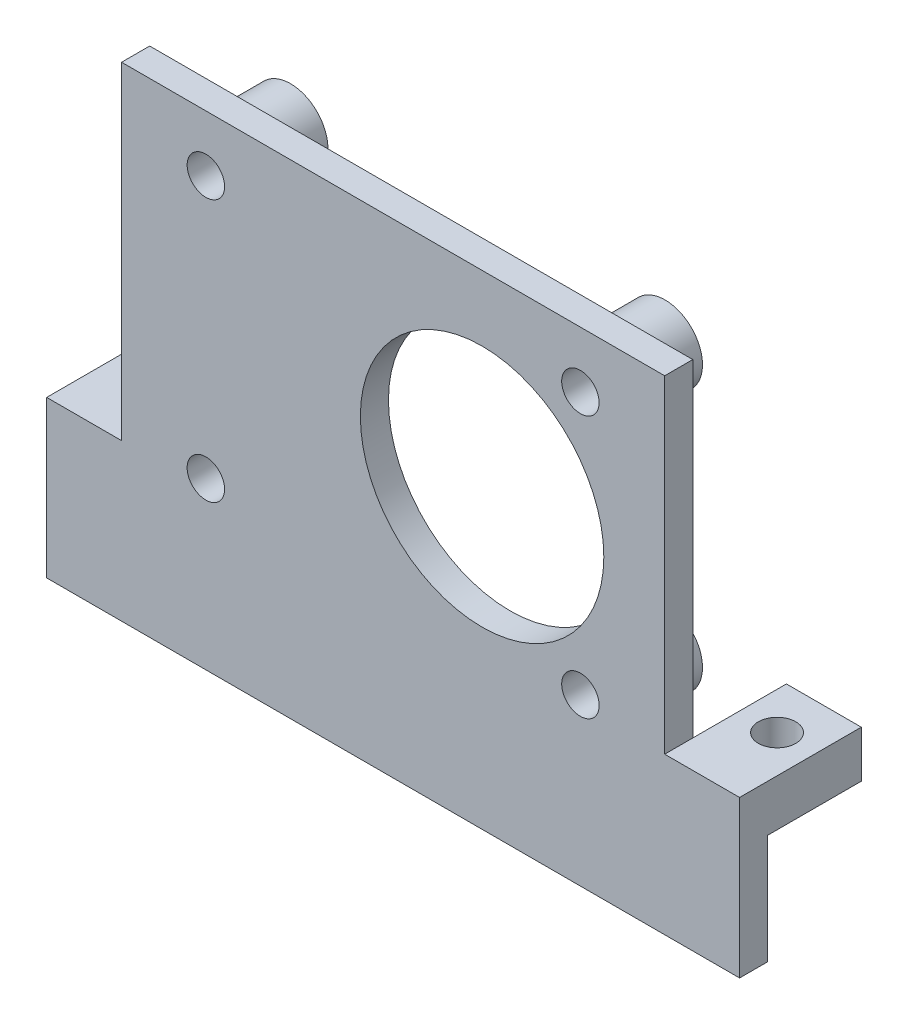
ISO-10303-21;
HEADER;
FILE_DESCRIPTION(('STEP AP214'),'2;1');
FILE_NAME('part.step','',(''),(''),'','','');
FILE_SCHEMA(('AUTOMOTIVE_DESIGN { 1 0 10303 214 1 1 1 1 }'));
ENDSEC;
DATA;
#1=APPLICATION_CONTEXT('core data for automotive mechanical design processes');
#2=APPLICATION_PROTOCOL_DEFINITION('international standard','automotive_design',2000,#1);
#3=PRODUCT_CONTEXT('',#1,'mechanical');
#4=PRODUCT('Part','Part','',(#3));
#5=PRODUCT_RELATED_PRODUCT_CATEGORY('part','',(#4));
#6=PRODUCT_DEFINITION_FORMATION('','',#4);
#7=PRODUCT_DEFINITION_CONTEXT('part definition',#1,'design');
#8=PRODUCT_DEFINITION('design','',#6,#7);
#9=PRODUCT_DEFINITION_SHAPE('','',#8);
#10=(LENGTH_UNIT() NAMED_UNIT(*) SI_UNIT(.MILLI.,.METRE.));
#11=(NAMED_UNIT(*) PLANE_ANGLE_UNIT() SI_UNIT($,.RADIAN.));
#12=(NAMED_UNIT(*) SI_UNIT($,.STERADIAN.) SOLID_ANGLE_UNIT());
#13=UNCERTAINTY_MEASURE_WITH_UNIT(LENGTH_MEASURE(1.E-05),#10,'distance_accuracy_value','');
#14=(GEOMETRIC_REPRESENTATION_CONTEXT(3) GLOBAL_UNCERTAINTY_ASSIGNED_CONTEXT((#13)) GLOBAL_UNIT_ASSIGNED_CONTEXT((#10,
#11,#12)) REPRESENTATION_CONTEXT('',''));
#15=CARTESIAN_POINT('',(0.,0.,0.));
#16=DIRECTION('',(0.,0.,1.));
#17=DIRECTION('',(1.,0.,0.));
#18=AXIS2_PLACEMENT_3D('',#15,#16,#17);
#19=CARTESIAN_POINT('',(49.,35.8359502095322,17.3521564849681));
#20=DIRECTION('',(0.,0.,-1.));
#21=DIRECTION('',(-1.,0.,0.));
#22=AXIS2_PLACEMENT_3D('',#19,#20,#21);
#23=CYLINDRICAL_SURFACE('',#22,2.);
#24=CARTESIAN_POINT('',(49.,35.8359502095322,0.));
#25=DIRECTION('',(0.,0.,1.));
#26=DIRECTION('',(1.,0.,0.));
#27=AXIS2_PLACEMENT_3D('',#24,#25,#26);
#28=CIRCLE('',#27,2.);
#29=CARTESIAN_POINT('',(51.,35.8359502095322,0.));
#30=VERTEX_POINT('',#29);
#31=EDGE_CURVE('E211',#30,#30,#28,.T.);
#32=ORIENTED_EDGE('',*,*,#31,.F.);
#33=EDGE_LOOP('',(#32));
#34=FACE_BOUND('',#33,.T.);
#35=CARTESIAN_POINT('',(49.,35.8359502095322,9.03844798598337));
#36=DIRECTION('',(0.,0.,1.));
#37=DIRECTION('',(1.,0.,0.));
#38=AXIS2_PLACEMENT_3D('',#35,#36,#37);
#39=CIRCLE('',#38,2.);
#40=CARTESIAN_POINT('',(51.,35.8359502095322,9.03844798598337));
#41=VERTEX_POINT('',#40);
#42=EDGE_CURVE('E360',#41,#41,#39,.F.);
#43=ORIENTED_EDGE('',*,*,#42,.F.);
#44=EDGE_LOOP('',(#43));
#45=FACE_BOUND('',#44,.T.);
#46=ADVANCED_FACE('F47',(#34,#45),#23,.F.);
#47=CARTESIAN_POINT('',(49.,35.8359502095322,17.3521564849681));
#48=DIRECTION('',(0.,0.,-1.));
#49=DIRECTION('',(-1.,0.,0.));
#50=AXIS2_PLACEMENT_3D('',#47,#48,#49);
#51=CYLINDRICAL_SURFACE('',#50,4.00000000000001);
#52=CARTESIAN_POINT('',(49.,35.8359502095322,0.));
#53=DIRECTION('',(0.,0.,1.));
#54=DIRECTION('',(1.,0.,0.));
#55=AXIS2_PLACEMENT_3D('',#52,#53,#54);
#56=CIRCLE('',#55,4.00000000000001);
#57=CARTESIAN_POINT('',(53.,35.8359502095322,0.));
#58=VERTEX_POINT('',#57);
#59=EDGE_CURVE('E208',#58,#58,#56,.T.);
#60=ORIENTED_EDGE('',*,*,#59,.T.);
#61=EDGE_LOOP('',(#60));
#62=FACE_BOUND('',#61,.T.);
#63=CARTESIAN_POINT('',(49.,35.8359502095322,6.03844798598337));
#64=DIRECTION('',(0.,0.,1.));
#65=DIRECTION('',(1.,0.,0.));
#66=AXIS2_PLACEMENT_3D('',#63,#64,#65);
#67=CIRCLE('',#66,4.00000000000001);
#68=CARTESIAN_POINT('',(53.,35.8359502095322,6.03844798598337));
#69=VERTEX_POINT('',#68);
#70=EDGE_CURVE('E214',#69,#69,#67,.T.);
#71=ORIENTED_EDGE('',*,*,#70,.F.);
#72=EDGE_LOOP('',(#71));
#73=FACE_BOUND('',#72,.T.);
#74=ADVANCED_FACE('F49',(#62,#73),#51,.T.);
#75=CARTESIAN_POINT('',(0.,0.,0.));
#76=DIRECTION('',(0.,0.,1.));
#77=DIRECTION('',(1.,0.,0.));
#78=AXIS2_PLACEMENT_3D('',#75,#76,#77);
#79=PLANE('',#78);
#80=ORIENTED_EDGE('',*,*,#31,.T.);
#81=EDGE_LOOP('',(#80));
#82=FACE_BOUND('',#81,.T.);
#83=ORIENTED_EDGE('',*,*,#59,.F.);
#84=EDGE_LOOP('',(#83));
#85=FACE_BOUND('',#84,.T.);
#86=ADVANCED_FACE('F228',(#82,#85),#79,.F.);
#87=CARTESIAN_POINT('',(0.,0.,6.03844798598337));
#88=DIRECTION('',(0.,0.,1.));
#89=DIRECTION('',(1.,0.,0.));
#90=AXIS2_PLACEMENT_3D('',#87,#88,#89);
#91=PLANE('',#90);
#92=CARTESIAN_POINT('',(38.5,21.8359502095322,6.03844798598337));
#93=DIRECTION('',(0.,0.,1.));
#94=DIRECTION('',(1.,0.,0.));
#95=AXIS2_PLACEMENT_3D('',#92,#93,#94);
#96=CIRCLE('',#95,13.);
#97=CARTESIAN_POINT('',(51.5,21.8359502095322,6.03844798598337));
#98=VERTEX_POINT('',#97);
#99=EDGE_CURVE('E354',#98,#98,#96,.F.);
#100=ORIENTED_EDGE('',*,*,#99,.F.);
#101=EDGE_LOOP('',(#100));
#102=FACE_BOUND('',#101,.T.);
#103=CARTESIAN_POINT('',(9.,35.8359502095322,6.03844798598337));
#104=DIRECTION('',(0.,0.,1.));
#105=DIRECTION('',(1.,0.,0.));
#106=AXIS2_PLACEMENT_3D('',#103,#104,#105);
#107=CIRCLE('',#106,4.);
#108=CARTESIAN_POINT('',(13.,35.8359502095322,6.03844798598337));
#109=VERTEX_POINT('',#108);
#110=EDGE_CURVE('E12',#109,#109,#107,.F.);
#111=ORIENTED_EDGE('',*,*,#110,.F.);
#112=EDGE_LOOP('',(#111));
#113=FACE_BOUND('',#112,.T.);
#114=CARTESIAN_POINT('',(9.,7.8359502095322,6.03844798598337));
#115=DIRECTION('',(0.,0.,1.));
#116=DIRECTION('',(1.,0.,0.));
#117=AXIS2_PLACEMENT_3D('',#114,#115,#116);
#118=CIRCLE('',#117,4.);
#119=CARTESIAN_POINT('',(13.,7.8359502095322,6.03844798598337));
#120=VERTEX_POINT('',#119);
#121=EDGE_CURVE('E56',#120,#120,#118,.F.);
#122=ORIENTED_EDGE('',*,*,#121,.F.);
#123=EDGE_LOOP('',(#122));
#124=FACE_BOUND('',#123,.T.);
#125=CARTESIAN_POINT('',(49.,7.8359502095322,6.03844798598337));
#126=DIRECTION('',(0.,0.,1.));
#127=DIRECTION('',(1.,0.,0.));
#128=AXIS2_PLACEMENT_3D('',#125,#126,#127);
#129=CIRCLE('',#128,4.00000000000001);
#130=CARTESIAN_POINT('',(53.,7.8359502095322,6.03844798598337));
#131=VERTEX_POINT('',#130);
#132=EDGE_CURVE('E217',#131,#131,#129,.F.);
#133=ORIENTED_EDGE('',*,*,#132,.F.);
#134=EDGE_LOOP('',(#133));
#135=FACE_BOUND('',#134,.T.);
#136=ORIENTED_EDGE('',*,*,#70,.T.);
#137=EDGE_LOOP('',(#136));
#138=FACE_BOUND('',#137,.T.);
#139=DIRECTION('',(0.,-1.,0.));
#140=VECTOR('',#139,1.);
#141=CARTESIAN_POINT('',(58.,6.83595020952914,6.03844798598335));
#142=LINE('',#141,#140);
#143=CARTESIAN_POINT('',(58.,6.83595020952914,6.03844798598335));
#144=VERTEX_POINT('',#143);
#145=CARTESIAN_POINT('',(58.,1.83595020952914,6.03844798598335));
#146=VERTEX_POINT('',#145);
#147=EDGE_CURVE('E160',#144,#146,#142,.T.);
#148=ORIENTED_EDGE('',*,*,#147,.T.);
#149=DIRECTION('',(1.,0.,0.));
#150=VECTOR('',#149,1.);
#151=CARTESIAN_POINT('',(58.,1.83595020952914,6.03844798598335));
#152=LINE('',#151,#150);
#153=CARTESIAN_POINT('',(66.,1.83595020952914,6.03844798598335));
#154=VERTEX_POINT('',#153);
#155=EDGE_CURVE('E369',#146,#154,#152,.T.);
#156=ORIENTED_EDGE('',*,*,#155,.T.);
#157=DIRECTION('',(0.,1.,0.));
#158=VECTOR('',#157,1.);
#159=CARTESIAN_POINT('',(66.,0.,6.03844798598337));
#160=LINE('',#159,#158);
#161=CARTESIAN_POINT('',(66.,-9.86404979046969,6.03844798598337));
#162=VERTEX_POINT('',#161);
#163=EDGE_CURVE('E184',#162,#154,#160,.T.);
#164=ORIENTED_EDGE('',*,*,#163,.F.);
#165=DIRECTION('',(1.,0.,0.));
#166=VECTOR('',#165,1.);
#167=CARTESIAN_POINT('',(0.,-9.86404979046969,6.03844798598337));
#168=LINE('',#167,#166);
#169=CARTESIAN_POINT('',(-8.,-9.86404979046969,6.03844798598337));
#170=VERTEX_POINT('',#169);
#171=EDGE_CURVE('E189',#170,#162,#168,.T.);
#172=ORIENTED_EDGE('',*,*,#171,.F.);
#173=DIRECTION('',(0.,1.,0.));
#174=VECTOR('',#173,1.);
#175=CARTESIAN_POINT('',(-8.00000000000001,0.,6.03844798598337));
#176=LINE('',#175,#174);
#177=CARTESIAN_POINT('',(-8.00000000000001,1.83595020952914,6.03844798598337));
#178=VERTEX_POINT('',#177);
#179=EDGE_CURVE('E68',#170,#178,#176,.T.);
#180=ORIENTED_EDGE('',*,*,#179,.T.);
#181=DIRECTION('',(1.,0.,0.));
#182=VECTOR('',#181,1.);
#183=CARTESIAN_POINT('',(0.,1.83595020952914,6.03844798598335));
#184=LINE('',#183,#182);
#185=CARTESIAN_POINT('',(0.,1.83595020952914,6.03844798598337));
#186=VERTEX_POINT('',#185);
#187=EDGE_CURVE('E63',#178,#186,#184,.T.);
#188=ORIENTED_EDGE('',*,*,#187,.T.);
#189=DIRECTION('',(0.,-1.,0.));
#190=VECTOR('',#189,1.);
#191=CARTESIAN_POINT('',(0.,6.83595020952914,6.03844798598335));
#192=LINE('',#191,#190);
#193=CARTESIAN_POINT('',(0.,6.83595020952914,6.03844798598335));
#194=VERTEX_POINT('',#193);
#195=EDGE_CURVE('E389',#194,#186,#192,.T.);
#196=ORIENTED_EDGE('',*,*,#195,.F.);
#197=DIRECTION('',(0.,1.,0.));
#198=VECTOR('',#197,1.);
#199=CARTESIAN_POINT('',(0.,0.,6.03844798598337));
#200=LINE('',#199,#198);
#201=CARTESIAN_POINT('',(0.,41.8359502095296,6.03844798598337));
#202=VERTEX_POINT('',#201);
#203=EDGE_CURVE('E422',#194,#202,#200,.T.);
#204=ORIENTED_EDGE('',*,*,#203,.T.);
#205=DIRECTION('',(1.,0.,0.));
#206=VECTOR('',#205,1.);
#207=CARTESIAN_POINT('',(0.,41.8359502095296,6.03844798598337));
#208=LINE('',#207,#206);
#209=CARTESIAN_POINT('',(58.,41.8359502095296,6.03844798598337));
#210=VERTEX_POINT('',#209);
#211=EDGE_CURVE('E183',#202,#210,#208,.T.);
#212=ORIENTED_EDGE('',*,*,#211,.T.);
#213=DIRECTION('',(0.,1.,0.));
#214=VECTOR('',#213,1.);
#215=CARTESIAN_POINT('',(58.,0.,6.03844798598337));
#216=LINE('',#215,#214);
#217=EDGE_CURVE('E173',#144,#210,#216,.T.);
#218=ORIENTED_EDGE('',*,*,#217,.F.);
#219=EDGE_LOOP('',(#148,#156,#164,#172,#180,#188,#196,#204,#212,#218));
#220=FACE_BOUND('',#219,.T.);
#221=ADVANCED_FACE('F180',(#102,#113,#124,#135,#138,#220),#91,.F.);
#222=CARTESIAN_POINT('',(0.,0.,9.03844798598337));
#223=DIRECTION('',(0.,0.,1.));
#224=DIRECTION('',(1.,0.,0.));
#225=AXIS2_PLACEMENT_3D('',#222,#223,#224);
#226=PLANE('',#225);
#227=CARTESIAN_POINT('',(9.,7.8359502095322,9.03844798598337));
#228=DIRECTION('',(0.,0.,1.));
#229=DIRECTION('',(1.,0.,0.));
#230=AXIS2_PLACEMENT_3D('',#227,#228,#229);
#231=CIRCLE('',#230,2.);
#232=CARTESIAN_POINT('',(11.,7.8359502095322,9.03844798598337));
#233=VERTEX_POINT('',#232);
#234=EDGE_CURVE('E702',#233,#233,#231,.F.);
#235=ORIENTED_EDGE('',*,*,#234,.T.);
#236=EDGE_LOOP('',(#235));
#237=FACE_BOUND('',#236,.T.);
#238=CARTESIAN_POINT('',(49.,7.8359502095322,9.03844798598337));
#239=DIRECTION('',(0.,0.,1.));
#240=DIRECTION('',(1.,0.,0.));
#241=AXIS2_PLACEMENT_3D('',#238,#239,#240);
#242=CIRCLE('',#241,2.);
#243=CARTESIAN_POINT('',(51.,7.8359502095322,9.03844798598337));
#244=VERTEX_POINT('',#243);
#245=EDGE_CURVE('E700',#244,#244,#242,.F.);
#246=ORIENTED_EDGE('',*,*,#245,.T.);
#247=EDGE_LOOP('',(#246));
#248=FACE_BOUND('',#247,.T.);
#249=CARTESIAN_POINT('',(38.5,21.8359502095322,9.03844798598337));
#250=DIRECTION('',(0.,0.,1.));
#251=DIRECTION('',(1.,0.,0.));
#252=AXIS2_PLACEMENT_3D('',#249,#250,#251);
#253=CIRCLE('',#252,13.);
#254=CARTESIAN_POINT('',(51.5,21.8359502095322,9.03844798598337));
#255=VERTEX_POINT('',#254);
#256=EDGE_CURVE('E51',#255,#255,#253,.F.);
#257=ORIENTED_EDGE('',*,*,#256,.T.);
#258=EDGE_LOOP('',(#257));
#259=FACE_BOUND('',#258,.T.);
#260=ORIENTED_EDGE('',*,*,#42,.T.);
#261=EDGE_LOOP('',(#260));
#262=FACE_BOUND('',#261,.T.);
#263=CARTESIAN_POINT('',(9.,35.8359502095322,9.03844798598337));
#264=DIRECTION('',(0.,0.,1.));
#265=DIRECTION('',(1.,0.,0.));
#266=AXIS2_PLACEMENT_3D('',#263,#264,#265);
#267=CIRCLE('',#266,2.);
#268=CARTESIAN_POINT('',(11.,35.8359502095322,9.03844798598337));
#269=VERTEX_POINT('',#268);
#270=EDGE_CURVE('E705',#269,#269,#267,.F.);
#271=ORIENTED_EDGE('',*,*,#270,.T.);
#272=EDGE_LOOP('',(#271));
#273=FACE_BOUND('',#272,.T.);
#274=DIRECTION('',(0.,1.,0.));
#275=VECTOR('',#274,1.);
#276=CARTESIAN_POINT('',(0.,0.,9.03844798598337));
#277=LINE('',#276,#275);
#278=CARTESIAN_POINT('',(0.,6.83595020953034,9.03844798598337));
#279=VERTEX_POINT('',#278);
#280=CARTESIAN_POINT('',(0.,41.8359502095296,9.03844798598337));
#281=VERTEX_POINT('',#280);
#282=EDGE_CURVE('E186',#279,#281,#277,.T.);
#283=ORIENTED_EDGE('',*,*,#282,.F.);
#284=DIRECTION('',(1.,0.,0.));
#285=VECTOR('',#284,1.);
#286=CARTESIAN_POINT('',(0.,6.83595020953034,9.03844798598337));
#287=LINE('',#286,#285);
#288=CARTESIAN_POINT('',(-8.00000000000001,6.83595020953034,9.03844798598337));
#289=VERTEX_POINT('',#288);
#290=EDGE_CURVE('E425',#289,#279,#287,.T.);
#291=ORIENTED_EDGE('',*,*,#290,.F.);
#292=DIRECTION('',(0.,1.,0.));
#293=VECTOR('',#292,1.);
#294=CARTESIAN_POINT('',(-8.00000000000001,0.,9.03844798598337));
#295=LINE('',#294,#293);
#296=CARTESIAN_POINT('',(-8.,-9.86404979046969,9.03844798598337));
#297=VERTEX_POINT('',#296);
#298=EDGE_CURVE('E428',#297,#289,#295,.T.);
#299=ORIENTED_EDGE('',*,*,#298,.F.);
#300=DIRECTION('',(1.,0.,0.));
#301=VECTOR('',#300,1.);
#302=CARTESIAN_POINT('',(0.,-9.86404979046969,9.03844798598337));
#303=LINE('',#302,#301);
#304=CARTESIAN_POINT('',(66.,-9.86404979046969,9.03844798598337));
#305=VERTEX_POINT('',#304);
#306=EDGE_CURVE('E432',#297,#305,#303,.T.);
#307=ORIENTED_EDGE('',*,*,#306,.T.);
#308=DIRECTION('',(0.,1.,0.));
#309=VECTOR('',#308,1.);
#310=CARTESIAN_POINT('',(66.,0.,9.03844798598337));
#311=LINE('',#310,#309);
#312=CARTESIAN_POINT('',(66.,6.83595020953034,9.03844798598337));
#313=VERTEX_POINT('',#312);
#314=EDGE_CURVE('E434',#305,#313,#311,.T.);
#315=ORIENTED_EDGE('',*,*,#314,.T.);
#316=CARTESIAN_POINT('',(58.,6.83595020953034,9.03844798598337));
#317=VERTEX_POINT('',#316);
#318=EDGE_CURVE('E429',#317,#313,#287,.T.);
#319=ORIENTED_EDGE('',*,*,#318,.F.);
#320=DIRECTION('',(0.,1.,0.));
#321=VECTOR('',#320,1.);
#322=CARTESIAN_POINT('',(58.,0.,9.03844798598337));
#323=LINE('',#322,#321);
#324=CARTESIAN_POINT('',(58.,41.8359502095296,9.03844798598337));
#325=VERTEX_POINT('',#324);
#326=EDGE_CURVE('E175',#317,#325,#323,.T.);
#327=ORIENTED_EDGE('',*,*,#326,.T.);
#328=DIRECTION('',(1.,0.,0.));
#329=VECTOR('',#328,1.);
#330=CARTESIAN_POINT('',(0.,41.8359502095296,9.03844798598337));
#331=LINE('',#330,#329);
#332=EDGE_CURVE('E195',#281,#325,#331,.T.);
#333=ORIENTED_EDGE('',*,*,#332,.F.);
#334=EDGE_LOOP('',(#283,#291,#299,#307,#315,#319,#327,#333));
#335=FACE_BOUND('',#334,.T.);
#336=ADVANCED_FACE('F227',(#237,#248,#259,#262,#273,#335),#226,.T.);
#337=CARTESIAN_POINT('',(0.,41.8359502095296,9.03844798598337));
#338=DIRECTION('',(0.,1.,0.));
#339=DIRECTION('',(0.,0.,1.));
#340=AXIS2_PLACEMENT_3D('',#337,#338,#339);
#341=PLANE('',#340);
#342=ORIENTED_EDGE('',*,*,#211,.F.);
#343=DIRECTION('',(0.,0.,-1.));
#344=VECTOR('',#343,1.);
#345=CARTESIAN_POINT('',(0.,41.8359502095296,9.03844798598337));
#346=LINE('',#345,#344);
#347=EDGE_CURVE('E193',#281,#202,#346,.T.);
#348=ORIENTED_EDGE('',*,*,#347,.F.);
#349=ORIENTED_EDGE('',*,*,#332,.T.);
#350=DIRECTION('',(0.,0.,-1.));
#351=VECTOR('',#350,1.);
#352=CARTESIAN_POINT('',(58.,41.8359502095296,9.03844798598337));
#353=LINE('',#352,#351);
#354=EDGE_CURVE('E178',#325,#210,#353,.T.);
#355=ORIENTED_EDGE('',*,*,#354,.T.);
#356=EDGE_LOOP('',(#342,#348,#349,#355));
#357=FACE_BOUND('',#356,.T.);
#358=ADVANCED_FACE('F273',(#357),#341,.T.);
#359=CARTESIAN_POINT('',(58.,0.,9.03844798598337));
#360=DIRECTION('',(-1.,0.,0.));
#361=DIRECTION('',(0.,0.,1.));
#362=AXIS2_PLACEMENT_3D('',#359,#360,#361);
#363=PLANE('',#362);
#364=ORIENTED_EDGE('',*,*,#217,.T.);
#365=ORIENTED_EDGE('',*,*,#354,.F.);
#366=ORIENTED_EDGE('',*,*,#326,.F.);
#367=DIRECTION('',(0.,0.,-1.));
#368=VECTOR('',#367,1.);
#369=CARTESIAN_POINT('',(58.,6.83595020953034,9.03844798598337));
#370=LINE('',#369,#368);
#371=EDGE_CURVE('E149',#317,#144,#370,.T.);
#372=ORIENTED_EDGE('',*,*,#371,.T.);
#373=EDGE_LOOP('',(#364,#365,#366,#372));
#374=FACE_BOUND('',#373,.T.);
#375=ADVANCED_FACE('F171',(#374),#363,.F.);
#376=CARTESIAN_POINT('',(0.,6.83595020953034,9.03844798598337));
#377=DIRECTION('',(0.,1.,0.));
#378=DIRECTION('',(0.,0.,1.));
#379=AXIS2_PLACEMENT_3D('',#376,#377,#378);
#380=PLANE('',#379);
#381=DIRECTION('',(0.,0.,-1.));
#382=VECTOR('',#381,1.);
#383=CARTESIAN_POINT('',(66.,6.83595020953034,9.03844798598337));
#384=LINE('',#383,#382);
#385=CARTESIAN_POINT('',(66.,6.83595020952915,-3.96155201401665));
#386=VERTEX_POINT('',#385);
#387=EDGE_CURVE('E177',#313,#386,#384,.T.);
#388=ORIENTED_EDGE('',*,*,#387,.T.);
#389=DIRECTION('',(-1.,0.,0.));
#390=VECTOR('',#389,1.);
#391=CARTESIAN_POINT('',(58.,6.83595020952915,-3.96155201401665));
#392=LINE('',#391,#390);
#393=CARTESIAN_POINT('',(58.,6.83595020952915,-3.96155201401665));
#394=VERTEX_POINT('',#393);
#395=EDGE_CURVE('E152',#386,#394,#392,.T.);
#396=ORIENTED_EDGE('',*,*,#395,.T.);
#397=DIRECTION('',(0.,0.,1.));
#398=VECTOR('',#397,1.);
#399=CARTESIAN_POINT('',(58.,6.83595020952914,6.03844798598335));
#400=LINE('',#399,#398);
#401=EDGE_CURVE('E143',#394,#144,#400,.T.);
#402=ORIENTED_EDGE('',*,*,#401,.T.);
#403=ORIENTED_EDGE('',*,*,#371,.F.);
#404=ORIENTED_EDGE('',*,*,#318,.T.);
#405=EDGE_LOOP('',(#388,#396,#402,#403,#404));
#406=FACE_BOUND('',#405,.T.);
#407=CARTESIAN_POINT('',(62.,6.83595020952915,1.03844798598335));
#408=DIRECTION('',(0.,1.,0.));
#409=DIRECTION('',(0.,0.,1.));
#410=AXIS2_PLACEMENT_3D('',#407,#408,#409);
#411=CIRCLE('',#410,1.99999999999691);
#412=CARTESIAN_POINT('',(62.,6.83595020952915,3.03844798598026));
#413=VERTEX_POINT('',#412);
#414=EDGE_CURVE('E358',#413,#413,#411,.T.);
#415=ORIENTED_EDGE('',*,*,#414,.F.);
#416=EDGE_LOOP('',(#415));
#417=FACE_BOUND('',#416,.T.);
#418=ADVANCED_FACE('F145',(#406,#417),#380,.T.);
#419=CARTESIAN_POINT('',(66.,0.,9.03844798598337));
#420=DIRECTION('',(-1.,0.,0.));
#421=DIRECTION('',(0.,0.,1.));
#422=AXIS2_PLACEMENT_3D('',#419,#420,#421);
#423=PLANE('',#422);
#424=ORIENTED_EDGE('',*,*,#163,.T.);
#425=DIRECTION('',(0.,0.,-1.));
#426=VECTOR('',#425,1.);
#427=CARTESIAN_POINT('',(66.,1.83595020952914,6.03844798598335));
#428=LINE('',#427,#426);
#429=CARTESIAN_POINT('',(66.,1.83595020952915,-3.96155201401665));
#430=VERTEX_POINT('',#429);
#431=EDGE_CURVE('E371',#154,#430,#428,.T.);
#432=ORIENTED_EDGE('',*,*,#431,.T.);
#433=DIRECTION('',(0.,-1.,0.));
#434=VECTOR('',#433,1.);
#435=CARTESIAN_POINT('',(66.,6.83595020952915,-3.96155201401665));
#436=LINE('',#435,#434);
#437=EDGE_CURVE('E167',#386,#430,#436,.T.);
#438=ORIENTED_EDGE('',*,*,#437,.F.);
#439=ORIENTED_EDGE('',*,*,#387,.F.);
#440=ORIENTED_EDGE('',*,*,#314,.F.);
#441=DIRECTION('',(0.,0.,-1.));
#442=VECTOR('',#441,1.);
#443=CARTESIAN_POINT('',(66.,-9.86404979046969,9.03844798598337));
#444=LINE('',#443,#442);
#445=EDGE_CURVE('E198',#305,#162,#444,.T.);
#446=ORIENTED_EDGE('',*,*,#445,.T.);
#447=EDGE_LOOP('',(#424,#432,#438,#439,#440,#446));
#448=FACE_BOUND('',#447,.T.);
#449=ADVANCED_FACE('F264',(#448),#423,.F.);
#450=CARTESIAN_POINT('',(0.,-9.86404979046969,9.03844798598337));
#451=DIRECTION('',(0.,1.,0.));
#452=DIRECTION('',(0.,0.,1.));
#453=AXIS2_PLACEMENT_3D('',#450,#451,#452);
#454=PLANE('',#453);
#455=ORIENTED_EDGE('',*,*,#171,.T.);
#456=ORIENTED_EDGE('',*,*,#445,.F.);
#457=ORIENTED_EDGE('',*,*,#306,.F.);
#458=DIRECTION('',(0.,0.,-1.));
#459=VECTOR('',#458,1.);
#460=CARTESIAN_POINT('',(-8.,-9.86404979046969,9.03844798598337));
#461=LINE('',#460,#459);
#462=EDGE_CURVE('E201',#297,#170,#461,.T.);
#463=ORIENTED_EDGE('',*,*,#462,.T.);
#464=EDGE_LOOP('',(#455,#456,#457,#463));
#465=FACE_BOUND('',#464,.T.);
#466=ADVANCED_FACE('F260',(#465),#454,.F.);
#467=CARTESIAN_POINT('',(-8.00000000000001,0.,9.03844798598337));
#468=DIRECTION('',(-1.,0.,0.));
#469=DIRECTION('',(0.,0.,1.));
#470=AXIS2_PLACEMENT_3D('',#467,#468,#469);
#471=PLANE('',#470);
#472=ORIENTED_EDGE('',*,*,#179,.F.);
#473=ORIENTED_EDGE('',*,*,#462,.F.);
#474=ORIENTED_EDGE('',*,*,#298,.T.);
#475=DIRECTION('',(0.,0.,-1.));
#476=VECTOR('',#475,1.);
#477=CARTESIAN_POINT('',(-8.00000000000001,6.83595020953034,9.03844798598337));
#478=LINE('',#477,#476);
#479=CARTESIAN_POINT('',(-8.,6.83595020952915,-3.96155201401665));
#480=VERTEX_POINT('',#479);
#481=EDGE_CURVE('E203',#289,#480,#478,.T.);
#482=ORIENTED_EDGE('',*,*,#481,.T.);
#483=DIRECTION('',(0.,-1.,0.));
#484=VECTOR('',#483,1.);
#485=CARTESIAN_POINT('',(-8.,6.83595020952915,-3.96155201401665));
#486=LINE('',#485,#484);
#487=CARTESIAN_POINT('',(-8.,1.83595020952914,-3.96155201401665));
#488=VERTEX_POINT('',#487);
#489=EDGE_CURVE('E398',#480,#488,#486,.T.);
#490=ORIENTED_EDGE('',*,*,#489,.T.);
#491=DIRECTION('',(0.,0.,1.));
#492=VECTOR('',#491,1.);
#493=CARTESIAN_POINT('',(-8.,1.83595020952914,-3.96155201401665));
#494=LINE('',#493,#492);
#495=EDGE_CURVE('E394',#488,#178,#494,.T.);
#496=ORIENTED_EDGE('',*,*,#495,.T.);
#497=EDGE_LOOP('',(#472,#473,#474,#482,#490,#496));
#498=FACE_BOUND('',#497,.T.);
#499=ADVANCED_FACE('F257',(#498),#471,.T.);
#500=DIRECTION('',(0.,0.,-1.));
#501=VECTOR('',#500,1.);
#502=CARTESIAN_POINT('',(0.,6.83595020953034,9.03844798598337));
#503=LINE('',#502,#501);
#504=EDGE_CURVE('E205',#279,#194,#503,.T.);
#505=ORIENTED_EDGE('',*,*,#504,.T.);
#506=DIRECTION('',(0.,0.,-1.));
#507=VECTOR('',#506,1.);
#508=CARTESIAN_POINT('',(0.,6.83595020952915,-3.96155201401665));
#509=LINE('',#508,#507);
#510=CARTESIAN_POINT('',(0.,6.83595020952915,-3.96155201401665));
#511=VERTEX_POINT('',#510);
#512=EDGE_CURVE('E383',#194,#511,#509,.T.);
#513=ORIENTED_EDGE('',*,*,#512,.T.);
#514=DIRECTION('',(-1.,0.,0.));
#515=VECTOR('',#514,1.);
#516=CARTESIAN_POINT('',(0.,6.83595020952915,-3.96155201401665));
#517=LINE('',#516,#515);
#518=EDGE_CURVE('E386',#511,#480,#517,.T.);
#519=ORIENTED_EDGE('',*,*,#518,.T.);
#520=ORIENTED_EDGE('',*,*,#481,.F.);
#521=ORIENTED_EDGE('',*,*,#290,.T.);
#522=EDGE_LOOP('',(#505,#513,#519,#520,#521));
#523=FACE_BOUND('',#522,.T.);
#524=CARTESIAN_POINT('',(-4.,6.83595020952914,1.03844798598335));
#525=DIRECTION('',(0.,1.,0.));
#526=DIRECTION('',(0.,0.,1.));
#527=AXIS2_PLACEMENT_3D('',#524,#525,#526);
#528=CIRCLE('',#527,1.99999999999692);
#529=CARTESIAN_POINT('',(-4.,6.83595020952914,3.03844798598027));
#530=VERTEX_POINT('',#529);
#531=EDGE_CURVE('E377',#530,#530,#528,.T.);
#532=ORIENTED_EDGE('',*,*,#531,.F.);
#533=EDGE_LOOP('',(#532));
#534=FACE_BOUND('',#533,.T.);
#535=ADVANCED_FACE('F255',(#523,#534),#380,.T.);
#536=CARTESIAN_POINT('',(0.,0.,9.03844798598337));
#537=DIRECTION('',(-1.,0.,0.));
#538=DIRECTION('',(0.,0.,1.));
#539=AXIS2_PLACEMENT_3D('',#536,#537,#538);
#540=PLANE('',#539);
#541=ORIENTED_EDGE('',*,*,#203,.F.);
#542=ORIENTED_EDGE('',*,*,#504,.F.);
#543=ORIENTED_EDGE('',*,*,#282,.T.);
#544=ORIENTED_EDGE('',*,*,#347,.T.);
#545=EDGE_LOOP('',(#541,#542,#543,#544));
#546=FACE_BOUND('',#545,.T.);
#547=ADVANCED_FACE('F251',(#546),#540,.T.);
#548=CARTESIAN_POINT('',(49.,7.8359502095322,17.3521564849681));
#549=DIRECTION('',(0.,0.,-1.));
#550=DIRECTION('',(-1.,0.,0.));
#551=AXIS2_PLACEMENT_3D('',#548,#549,#550);
#552=CYLINDRICAL_SURFACE('',#551,2.);
#553=CARTESIAN_POINT('',(49.,7.8359502095322,0.));
#554=DIRECTION('',(0.,0.,1.));
#555=DIRECTION('',(1.,0.,0.));
#556=AXIS2_PLACEMENT_3D('',#553,#554,#555);
#557=CIRCLE('',#556,2.);
#558=CARTESIAN_POINT('',(51.,7.8359502095322,0.));
#559=VERTEX_POINT('',#558);
#560=EDGE_CURVE('E419',#559,#559,#557,.T.);
#561=ORIENTED_EDGE('',*,*,#560,.F.);
#562=EDGE_LOOP('',(#561));
#563=FACE_BOUND('',#562,.T.);
#564=ORIENTED_EDGE('',*,*,#245,.F.);
#565=EDGE_LOOP('',(#564));
#566=FACE_BOUND('',#565,.T.);
#567=ADVANCED_FACE('F254',(#563,#566),#552,.F.);
#568=CARTESIAN_POINT('',(49.,7.8359502095322,17.3521564849681));
#569=DIRECTION('',(0.,0.,-1.));
#570=DIRECTION('',(-1.,0.,0.));
#571=AXIS2_PLACEMENT_3D('',#568,#569,#570);
#572=CYLINDRICAL_SURFACE('',#571,4.00000000000001);
#573=CARTESIAN_POINT('',(49.,7.8359502095322,0.));
#574=DIRECTION('',(0.,0.,1.));
#575=DIRECTION('',(1.,0.,0.));
#576=AXIS2_PLACEMENT_3D('',#573,#574,#575);
#577=CIRCLE('',#576,4.00000000000001);
#578=CARTESIAN_POINT('',(53.,7.8359502095322,0.));
#579=VERTEX_POINT('',#578);
#580=EDGE_CURVE('E416',#579,#579,#577,.T.);
#581=ORIENTED_EDGE('',*,*,#580,.T.);
#582=EDGE_LOOP('',(#581));
#583=FACE_BOUND('',#582,.T.);
#584=ORIENTED_EDGE('',*,*,#132,.T.);
#585=EDGE_LOOP('',(#584));
#586=FACE_BOUND('',#585,.T.);
#587=ADVANCED_FACE('F280',(#583,#586),#572,.T.);
#588=CARTESIAN_POINT('',(0.,0.,0.));
#589=DIRECTION('',(0.,0.,1.));
#590=DIRECTION('',(1.,0.,0.));
#591=AXIS2_PLACEMENT_3D('',#588,#589,#590);
#592=PLANE('',#591);
#593=ORIENTED_EDGE('',*,*,#560,.T.);
#594=EDGE_LOOP('',(#593));
#595=FACE_BOUND('',#594,.T.);
#596=ORIENTED_EDGE('',*,*,#580,.F.);
#597=EDGE_LOOP('',(#596));
#598=FACE_BOUND('',#597,.T.);
#599=ADVANCED_FACE('F283',(#595,#598),#592,.F.);
#600=CARTESIAN_POINT('',(9.,7.8359502095322,17.3521564849681));
#601=DIRECTION('',(0.,0.,-1.));
#602=DIRECTION('',(-1.,0.,0.));
#603=AXIS2_PLACEMENT_3D('',#600,#601,#602);
#604=CYLINDRICAL_SURFACE('',#603,2.);
#605=CARTESIAN_POINT('',(9.,7.8359502095322,0.));
#606=DIRECTION('',(0.,0.,1.));
#607=DIRECTION('',(1.,0.,0.));
#608=AXIS2_PLACEMENT_3D('',#605,#606,#607);
#609=CIRCLE('',#608,2.);
#610=CARTESIAN_POINT('',(11.,7.8359502095322,0.));
#611=VERTEX_POINT('',#610);
#612=EDGE_CURVE('E413',#611,#611,#609,.T.);
#613=ORIENTED_EDGE('',*,*,#612,.F.);
#614=EDGE_LOOP('',(#613));
#615=FACE_BOUND('',#614,.T.);
#616=ORIENTED_EDGE('',*,*,#234,.F.);
#617=EDGE_LOOP('',(#616));
#618=FACE_BOUND('',#617,.T.);
#619=ADVANCED_FACE('F290',(#615,#618),#604,.F.);
#620=CARTESIAN_POINT('',(9.,7.8359502095322,17.3521564849681));
#621=DIRECTION('',(0.,0.,-1.));
#622=DIRECTION('',(-1.,0.,0.));
#623=AXIS2_PLACEMENT_3D('',#620,#621,#622);
#624=CYLINDRICAL_SURFACE('',#623,4.);
#625=CARTESIAN_POINT('',(9.,7.8359502095322,0.));
#626=DIRECTION('',(0.,0.,1.));
#627=DIRECTION('',(1.,0.,0.));
#628=AXIS2_PLACEMENT_3D('',#625,#626,#627);
#629=CIRCLE('',#628,4.);
#630=CARTESIAN_POINT('',(13.,7.8359502095322,0.));
#631=VERTEX_POINT('',#630);
#632=EDGE_CURVE('E410',#631,#631,#629,.T.);
#633=ORIENTED_EDGE('',*,*,#632,.T.);
#634=EDGE_LOOP('',(#633));
#635=FACE_BOUND('',#634,.T.);
#636=ORIENTED_EDGE('',*,*,#121,.T.);
#637=EDGE_LOOP('',(#636));
#638=FACE_BOUND('',#637,.T.);
#639=ADVANCED_FACE('F223',(#635,#638),#624,.T.);
#640=CARTESIAN_POINT('',(0.,0.,0.));
#641=DIRECTION('',(0.,0.,1.));
#642=DIRECTION('',(1.,0.,0.));
#643=AXIS2_PLACEMENT_3D('',#640,#641,#642);
#644=PLANE('',#643);
#645=ORIENTED_EDGE('',*,*,#612,.T.);
#646=EDGE_LOOP('',(#645));
#647=FACE_BOUND('',#646,.T.);
#648=ORIENTED_EDGE('',*,*,#632,.F.);
#649=EDGE_LOOP('',(#648));
#650=FACE_BOUND('',#649,.T.);
#651=ADVANCED_FACE('F294',(#647,#650),#644,.F.);
#652=CARTESIAN_POINT('',(9.,35.8359502095322,17.3521564849681));
#653=DIRECTION('',(0.,0.,-1.));
#654=DIRECTION('',(-1.,0.,0.));
#655=AXIS2_PLACEMENT_3D('',#652,#653,#654);
#656=CYLINDRICAL_SURFACE('',#655,2.);
#657=CARTESIAN_POINT('',(9.,35.8359502095322,0.));
#658=DIRECTION('',(0.,0.,1.));
#659=DIRECTION('',(1.,0.,0.));
#660=AXIS2_PLACEMENT_3D('',#657,#658,#659);
#661=CIRCLE('',#660,2.);
#662=CARTESIAN_POINT('',(11.,35.8359502095322,0.));
#663=VERTEX_POINT('',#662);
#664=EDGE_CURVE('E407',#663,#663,#661,.T.);
#665=ORIENTED_EDGE('',*,*,#664,.F.);
#666=EDGE_LOOP('',(#665));
#667=FACE_BOUND('',#666,.T.);
#668=ORIENTED_EDGE('',*,*,#270,.F.);
#669=EDGE_LOOP('',(#668));
#670=FACE_BOUND('',#669,.T.);
#671=ADVANCED_FACE('F301',(#667,#670),#656,.F.);
#672=CARTESIAN_POINT('',(9.,35.8359502095322,17.3521564849681));
#673=DIRECTION('',(0.,0.,-1.));
#674=DIRECTION('',(-1.,0.,0.));
#675=AXIS2_PLACEMENT_3D('',#672,#673,#674);
#676=CYLINDRICAL_SURFACE('',#675,4.);
#677=CARTESIAN_POINT('',(9.,35.8359502095322,0.));
#678=DIRECTION('',(0.,0.,1.));
#679=DIRECTION('',(1.,0.,0.));
#680=AXIS2_PLACEMENT_3D('',#677,#678,#679);
#681=CIRCLE('',#680,4.);
#682=CARTESIAN_POINT('',(13.,35.8359502095322,0.));
#683=VERTEX_POINT('',#682);
#684=EDGE_CURVE('E404',#683,#683,#681,.T.);
#685=ORIENTED_EDGE('',*,*,#684,.T.);
#686=EDGE_LOOP('',(#685));
#687=FACE_BOUND('',#686,.T.);
#688=ORIENTED_EDGE('',*,*,#110,.T.);
#689=EDGE_LOOP('',(#688));
#690=FACE_BOUND('',#689,.T.);
#691=ADVANCED_FACE('F303',(#687,#690),#676,.T.);
#692=CARTESIAN_POINT('',(0.,0.,0.));
#693=DIRECTION('',(0.,0.,1.));
#694=DIRECTION('',(1.,0.,0.));
#695=AXIS2_PLACEMENT_3D('',#692,#693,#694);
#696=PLANE('',#695);
#697=ORIENTED_EDGE('',*,*,#664,.T.);
#698=EDGE_LOOP('',(#697));
#699=FACE_BOUND('',#698,.T.);
#700=ORIENTED_EDGE('',*,*,#684,.F.);
#701=EDGE_LOOP('',(#700));
#702=FACE_BOUND('',#701,.T.);
#703=ADVANCED_FACE('F306',(#699,#702),#696,.F.);
#704=CARTESIAN_POINT('',(0.,1.83595020952914,0.));
#705=DIRECTION('',(0.,-1.,0.));
#706=DIRECTION('',(0.,0.,-1.));
#707=AXIS2_PLACEMENT_3D('',#704,#705,#706);
#708=PLANE('',#707);
#709=DIRECTION('',(0.,0.,-1.));
#710=VECTOR('',#709,1.);
#711=CARTESIAN_POINT('',(0.,1.83595020952915,-3.96155201401665));
#712=LINE('',#711,#710);
#713=CARTESIAN_POINT('',(0.,1.83595020952915,-3.96155201401665));
#714=VERTEX_POINT('',#713);
#715=EDGE_CURVE('E380',#186,#714,#712,.T.);
#716=ORIENTED_EDGE('',*,*,#715,.F.);
#717=ORIENTED_EDGE('',*,*,#187,.F.);
#718=ORIENTED_EDGE('',*,*,#495,.F.);
#719=DIRECTION('',(-1.,0.,0.));
#720=VECTOR('',#719,1.);
#721=CARTESIAN_POINT('',(0.,1.83595020952915,-3.96155201401665));
#722=LINE('',#721,#720);
#723=EDGE_CURVE('E392',#714,#488,#722,.T.);
#724=ORIENTED_EDGE('',*,*,#723,.F.);
#725=EDGE_LOOP('',(#716,#717,#718,#724));
#726=FACE_BOUND('',#725,.T.);
#727=CARTESIAN_POINT('',(-4.,1.83595020952914,1.03844798598335));
#728=DIRECTION('',(0.,1.,0.));
#729=DIRECTION('',(0.,0.,1.));
#730=AXIS2_PLACEMENT_3D('',#727,#728,#729);
#731=CIRCLE('',#730,1.99999999999692);
#732=CARTESIAN_POINT('',(-4.,1.83595020952914,3.03844798598027));
#733=VERTEX_POINT('',#732);
#734=EDGE_CURVE('E166',#733,#733,#731,.T.);
#735=ORIENTED_EDGE('',*,*,#734,.T.);
#736=EDGE_LOOP('',(#735));
#737=FACE_BOUND('',#736,.T.);
#738=ADVANCED_FACE('F313',(#726,#737),#708,.T.);
#739=CARTESIAN_POINT('',(0.,6.83595020952915,-3.96155201401665));
#740=DIRECTION('',(-1.,0.,0.));
#741=DIRECTION('',(0.,0.,1.));
#742=AXIS2_PLACEMENT_3D('',#739,#740,#741);
#743=PLANE('',#742);
#744=ORIENTED_EDGE('',*,*,#715,.T.);
#745=DIRECTION('',(0.,-1.,0.));
#746=VECTOR('',#745,1.);
#747=CARTESIAN_POINT('',(0.,6.83595020952915,-3.96155201401665));
#748=LINE('',#747,#746);
#749=EDGE_CURVE('E401',#511,#714,#748,.T.);
#750=ORIENTED_EDGE('',*,*,#749,.F.);
#751=ORIENTED_EDGE('',*,*,#512,.F.);
#752=ORIENTED_EDGE('',*,*,#195,.T.);
#753=EDGE_LOOP('',(#744,#750,#751,#752));
#754=FACE_BOUND('',#753,.T.);
#755=ADVANCED_FACE('F315',(#754),#743,.F.);
#756=CARTESIAN_POINT('',(0.,6.83595020952915,-3.96155201401665));
#757=DIRECTION('',(0.,0.,1.));
#758=DIRECTION('',(1.,0.,0.));
#759=AXIS2_PLACEMENT_3D('',#756,#757,#758);
#760=PLANE('',#759);
#761=ORIENTED_EDGE('',*,*,#723,.T.);
#762=ORIENTED_EDGE('',*,*,#489,.F.);
#763=ORIENTED_EDGE('',*,*,#518,.F.);
#764=ORIENTED_EDGE('',*,*,#749,.T.);
#765=EDGE_LOOP('',(#761,#762,#763,#764));
#766=FACE_BOUND('',#765,.T.);
#767=ADVANCED_FACE('F318',(#766),#760,.F.);
#768=CARTESIAN_POINT('',(-4.,6.83595020952914,1.03844798598335));
#769=DIRECTION('',(0.,-1.,0.));
#770=DIRECTION('',(0.,0.,-1.));
#771=AXIS2_PLACEMENT_3D('',#768,#769,#770);
#772=CYLINDRICAL_SURFACE('',#771,1.99999999999692);
#773=ORIENTED_EDGE('',*,*,#531,.T.);
#774=EDGE_LOOP('',(#773));
#775=FACE_BOUND('',#774,.T.);
#776=ORIENTED_EDGE('',*,*,#734,.F.);
#777=EDGE_LOOP('',(#776));
#778=FACE_BOUND('',#777,.T.);
#779=ADVANCED_FACE('F322',(#775,#778),#772,.F.);
#780=CARTESIAN_POINT('',(0.,1.83595020952915,0.));
#781=DIRECTION('',(0.,-1.,0.));
#782=DIRECTION('',(0.,0.,-1.));
#783=AXIS2_PLACEMENT_3D('',#780,#781,#782);
#784=PLANE('',#783);
#785=DIRECTION('',(0.,0.,1.));
#786=VECTOR('',#785,1.);
#787=CARTESIAN_POINT('',(58.,1.83595020952914,6.03844798598335));
#788=LINE('',#787,#786);
#789=CARTESIAN_POINT('',(58.,1.83595020952915,-3.96155201401665));
#790=VERTEX_POINT('',#789);
#791=EDGE_CURVE('E163',#790,#146,#788,.T.);
#792=ORIENTED_EDGE('',*,*,#791,.F.);
#793=DIRECTION('',(-1.,0.,0.));
#794=VECTOR('',#793,1.);
#795=CARTESIAN_POINT('',(58.,1.83595020952915,-3.96155201401665));
#796=LINE('',#795,#794);
#797=EDGE_CURVE('E156',#430,#790,#796,.T.);
#798=ORIENTED_EDGE('',*,*,#797,.F.);
#799=ORIENTED_EDGE('',*,*,#431,.F.);
#800=ORIENTED_EDGE('',*,*,#155,.F.);
#801=EDGE_LOOP('',(#792,#798,#799,#800));
#802=FACE_BOUND('',#801,.T.);
#803=CARTESIAN_POINT('',(62.,1.83595020952915,1.03844798598335));
#804=DIRECTION('',(0.,1.,0.));
#805=DIRECTION('',(0.,0.,1.));
#806=AXIS2_PLACEMENT_3D('',#803,#804,#805);
#807=CIRCLE('',#806,1.99999999999691);
#808=CARTESIAN_POINT('',(62.,1.83595020952914,3.03844798598026));
#809=VERTEX_POINT('',#808);
#810=EDGE_CURVE('E355',#809,#809,#807,.T.);
#811=ORIENTED_EDGE('',*,*,#810,.T.);
#812=EDGE_LOOP('',(#811));
#813=FACE_BOUND('',#812,.T.);
#814=ADVANCED_FACE('F329',(#802,#813),#784,.T.);
#815=CARTESIAN_POINT('',(58.,6.83595020952914,6.03844798598335));
#816=DIRECTION('',(1.,0.,0.));
#817=DIRECTION('',(0.,1.,0.));
#818=AXIS2_PLACEMENT_3D('',#815,#816,#817);
#819=PLANE('',#818);
#820=ORIENTED_EDGE('',*,*,#791,.T.);
#821=ORIENTED_EDGE('',*,*,#147,.F.);
#822=ORIENTED_EDGE('',*,*,#401,.F.);
#823=DIRECTION('',(0.,-1.,0.));
#824=VECTOR('',#823,1.);
#825=CARTESIAN_POINT('',(58.,6.83595020952915,-3.96155201401665));
#826=LINE('',#825,#824);
#827=EDGE_CURVE('E367',#394,#790,#826,.T.);
#828=ORIENTED_EDGE('',*,*,#827,.T.);
#829=EDGE_LOOP('',(#820,#821,#822,#828));
#830=FACE_BOUND('',#829,.T.);
#831=ADVANCED_FACE('F161',(#830),#819,.F.);
#832=CARTESIAN_POINT('',(58.,6.83595020952915,-3.96155201401665));
#833=DIRECTION('',(0.,0.,1.));
#834=DIRECTION('',(0.,-1.,0.));
#835=AXIS2_PLACEMENT_3D('',#832,#833,#834);
#836=PLANE('',#835);
#837=ORIENTED_EDGE('',*,*,#797,.T.);
#838=ORIENTED_EDGE('',*,*,#827,.F.);
#839=ORIENTED_EDGE('',*,*,#395,.F.);
#840=ORIENTED_EDGE('',*,*,#437,.T.);
#841=EDGE_LOOP('',(#837,#838,#839,#840));
#842=FACE_BOUND('',#841,.T.);
#843=ADVANCED_FACE('F333',(#842),#836,.F.);
#844=CARTESIAN_POINT('',(62.,6.83595020952915,1.03844798598335));
#845=DIRECTION('',(0.,-1.,0.));
#846=DIRECTION('',(0.,0.,-1.));
#847=AXIS2_PLACEMENT_3D('',#844,#845,#846);
#848=CYLINDRICAL_SURFACE('',#847,1.99999999999691);
#849=ORIENTED_EDGE('',*,*,#414,.T.);
#850=EDGE_LOOP('',(#849));
#851=FACE_BOUND('',#850,.T.);
#852=ORIENTED_EDGE('',*,*,#810,.F.);
#853=EDGE_LOOP('',(#852));
#854=FACE_BOUND('',#853,.T.);
#855=ADVANCED_FACE('F336',(#851,#854),#848,.F.);
#856=CARTESIAN_POINT('',(38.5,21.8359502095322,10.));
#857=DIRECTION('',(0.,0.,-1.));
#858=DIRECTION('',(-1.,0.,0.));
#859=AXIS2_PLACEMENT_3D('',#856,#857,#858);
#860=CYLINDRICAL_SURFACE('',#859,13.);
#861=ORIENTED_EDGE('',*,*,#256,.F.);
#862=EDGE_LOOP('',(#861));
#863=FACE_BOUND('',#862,.T.);
#864=ORIENTED_EDGE('',*,*,#99,.T.);
#865=EDGE_LOOP('',(#864));
#866=FACE_BOUND('',#865,.T.);
#867=ADVANCED_FACE('F343',(#863,#866),#860,.F.);
#868=CLOSED_SHELL('',(#46,#74,#86,#221,#336,#358,#375,#418,#449,#466,#499,#535,#547,#567,#587,
#599,#619,#639,#651,#671,#691,#703,#738,#755,#767,#779,#814,#831,#843,#855,#867));
#869=MANIFOLD_SOLID_BREP('B2',#868);
#870=ADVANCED_BREP_SHAPE_REPRESENTATION('',(#18,#869),#14);
#871=SHAPE_DEFINITION_REPRESENTATION(#9,#870);
ENDSEC;
END-ISO-10303-21;
